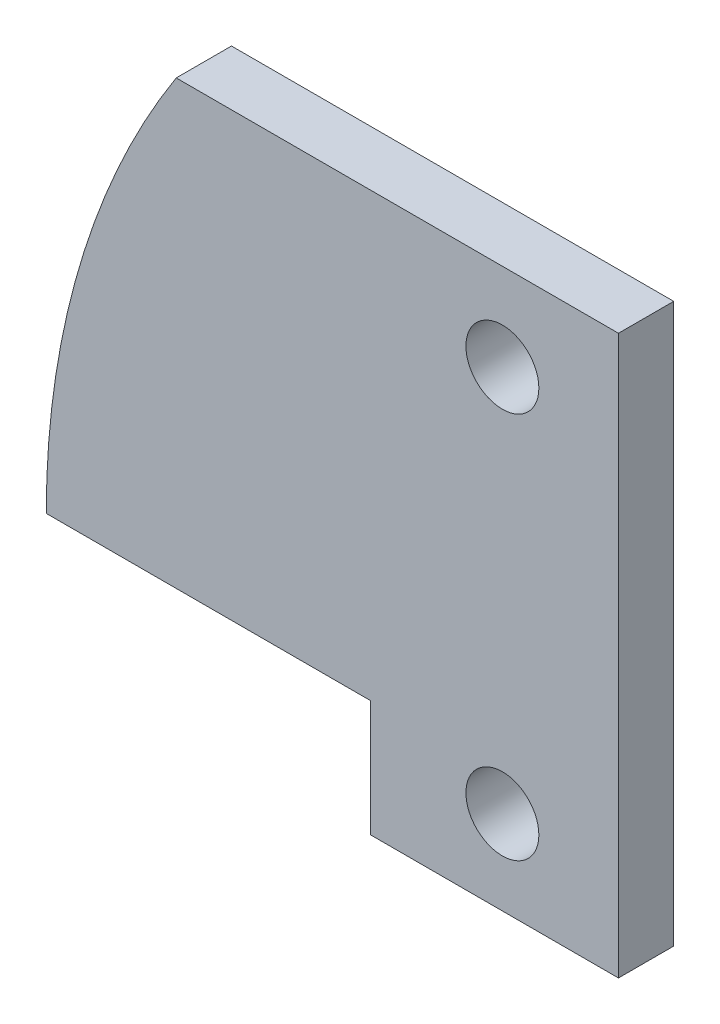
ISO-10303-21;
HEADER;
FILE_DESCRIPTION(('STEP AP214'),'2;1');
FILE_NAME('part.step','',(''),(''),'','','');
FILE_SCHEMA(('AUTOMOTIVE_DESIGN { 1 0 10303 214 1 1 1 1 }'));
ENDSEC;
DATA;
#1=APPLICATION_CONTEXT('core data for automotive mechanical design processes');
#2=APPLICATION_PROTOCOL_DEFINITION('international standard','automotive_design',2000,#1);
#3=PRODUCT_CONTEXT('',#1,'mechanical');
#4=PRODUCT('Part','Part','',(#3));
#5=PRODUCT_RELATED_PRODUCT_CATEGORY('part','',(#4));
#6=PRODUCT_DEFINITION_FORMATION('','',#4);
#7=PRODUCT_DEFINITION_CONTEXT('part definition',#1,'design');
#8=PRODUCT_DEFINITION('design','',#6,#7);
#9=PRODUCT_DEFINITION_SHAPE('','',#8);
#10=(LENGTH_UNIT() NAMED_UNIT(*) SI_UNIT(.MILLI.,.METRE.));
#11=(NAMED_UNIT(*) PLANE_ANGLE_UNIT() SI_UNIT($,.RADIAN.));
#12=(NAMED_UNIT(*) SI_UNIT($,.STERADIAN.) SOLID_ANGLE_UNIT());
#13=UNCERTAINTY_MEASURE_WITH_UNIT(LENGTH_MEASURE(1.E-05),#10,'distance_accuracy_value','');
#14=(GEOMETRIC_REPRESENTATION_CONTEXT(3) GLOBAL_UNCERTAINTY_ASSIGNED_CONTEXT((#13)) GLOBAL_UNIT_ASSIGNED_CONTEXT((#10,
#11,#12)) REPRESENTATION_CONTEXT('',''));
#15=CARTESIAN_POINT('',(0.,0.,0.));
#16=DIRECTION('',(0.,0.,1.));
#17=DIRECTION('',(1.,0.,0.));
#18=AXIS2_PLACEMENT_3D('',#15,#16,#17);
#19=CARTESIAN_POINT('',(23.0809539533338,3.25769141997411,2.5));
#20=DIRECTION('',(0.,0.,-1.));
#21=DIRECTION('',(-1.,0.,0.));
#22=AXIS2_PLACEMENT_3D('',#19,#20,#21);
#23=PLANE('',#22);
#24=CARTESIAN_POINT('',(23.0809539533338,3.25769141997411,2.5));
#25=DIRECTION('',(0.,0.,1.));
#26=DIRECTION('',(-1.,0.,0.));
#27=AXIS2_PLACEMENT_3D('',#24,#25,#26);
#28=CIRCLE('',#27,36.9636140147744);
#29=CARTESIAN_POINT('',(-8.00455329736466,23.2576914199741,2.5));
#30=VERTEX_POINT('',#29);
#31=CARTESIAN_POINT('',(-13.8826600614406,3.25769141997411,2.5));
#32=VERTEX_POINT('',#31);
#33=EDGE_CURVE('E153',#30,#32,#28,.T.);
#34=ORIENTED_EDGE('',*,*,#33,.T.);
#35=DIRECTION('',(1.,0.,0.));
#36=VECTOR('',#35,1.);
#37=CARTESIAN_POINT('',(-13.8826600614406,3.25769141997411,2.5));
#38=LINE('',#37,#36);
#39=CARTESIAN_POINT('',(0.775731814030067,3.25769141997411,2.5));
#40=VERTEX_POINT('',#39);
#41=EDGE_CURVE('E99',#32,#40,#38,.T.);
#42=ORIENTED_EDGE('',*,*,#41,.T.);
#43=DIRECTION('',(0.,-1.,0.));
#44=VECTOR('',#43,1.);
#45=CARTESIAN_POINT('',(0.775731814030067,3.25769141997411,2.5));
#46=LINE('',#45,#44);
#47=CARTESIAN_POINT('',(0.775731814030068,-2.,2.5));
#48=VERTEX_POINT('',#47);
#49=EDGE_CURVE('E112',#40,#48,#46,.T.);
#50=ORIENTED_EDGE('',*,*,#49,.T.);
#51=DIRECTION('',(1.,0.,0.));
#52=VECTOR('',#51,1.);
#53=CARTESIAN_POINT('',(0.775731814030068,-2.,2.5));
#54=LINE('',#53,#52);
#55=CARTESIAN_POINT('',(12.,-2.,2.5));
#56=VERTEX_POINT('',#55);
#57=EDGE_CURVE('E106',#48,#56,#54,.T.);
#58=ORIENTED_EDGE('',*,*,#57,.T.);
#59=DIRECTION('',(0.,1.,0.));
#60=VECTOR('',#59,1.);
#61=CARTESIAN_POINT('',(12.,-2.,2.5));
#62=LINE('',#61,#60);
#63=CARTESIAN_POINT('',(12.,23.2576914199741,2.5));
#64=VERTEX_POINT('',#63);
#65=EDGE_CURVE('E110',#56,#64,#62,.T.);
#66=ORIENTED_EDGE('',*,*,#65,.T.);
#67=DIRECTION('',(-1.,0.,0.));
#68=VECTOR('',#67,1.);
#69=CARTESIAN_POINT('',(-8.00455329736466,23.2576914199741,2.5));
#70=LINE('',#69,#68);
#71=EDGE_CURVE('E63',#64,#30,#70,.T.);
#72=ORIENTED_EDGE('',*,*,#71,.T.);
#73=EDGE_LOOP('',(#34,#42,#50,#58,#66,#72));
#74=FACE_BOUND('',#73,.T.);
#75=CARTESIAN_POINT('',(6.74921920985469,19.3061015005349,2.5));
#76=DIRECTION('',(0.,0.,1.));
#77=DIRECTION('',(1.,0.,0.));
#78=AXIS2_PLACEMENT_3D('',#75,#76,#77);
#79=CIRCLE('',#78,1.65);
#80=CARTESIAN_POINT('',(8.39921920985469,19.3061015005349,2.5));
#81=VERTEX_POINT('',#80);
#82=EDGE_CURVE('E140',#81,#81,#79,.T.);
#83=ORIENTED_EDGE('',*,*,#82,.F.);
#84=EDGE_LOOP('',(#83));
#85=FACE_BOUND('',#84,.T.);
#86=CARTESIAN_POINT('',(6.74921920985468,1.80610150053489,2.5));
#87=DIRECTION('',(0.,0.,1.));
#88=DIRECTION('',(1.,0.,0.));
#89=AXIS2_PLACEMENT_3D('',#86,#87,#88);
#90=CIRCLE('',#89,1.65);
#91=CARTESIAN_POINT('',(8.39921920985469,1.80610150053489,2.5));
#92=VERTEX_POINT('',#91);
#93=EDGE_CURVE('E198',#92,#92,#90,.T.);
#94=ORIENTED_EDGE('',*,*,#93,.F.);
#95=EDGE_LOOP('',(#94));
#96=FACE_BOUND('',#95,.T.);
#97=ADVANCED_FACE('F45',(#74,#85,#96),#23,.F.);
#98=CARTESIAN_POINT('',(23.0809539533338,3.25769141997411,0.));
#99=DIRECTION('',(0.,0.,-1.));
#100=DIRECTION('',(-1.,0.,0.));
#101=AXIS2_PLACEMENT_3D('',#98,#99,#100);
#102=PLANE('',#101);
#103=CARTESIAN_POINT('',(6.74921920985469,19.3061015005349,0.));
#104=DIRECTION('',(0.,0.,1.));
#105=DIRECTION('',(1.,0.,0.));
#106=AXIS2_PLACEMENT_3D('',#103,#104,#105);
#107=CIRCLE('',#106,1.65);
#108=CARTESIAN_POINT('',(8.39921920985469,19.3061015005349,0.));
#109=VERTEX_POINT('',#108);
#110=EDGE_CURVE('E205',#109,#109,#107,.T.);
#111=ORIENTED_EDGE('',*,*,#110,.T.);
#112=EDGE_LOOP('',(#111));
#113=FACE_BOUND('',#112,.T.);
#114=CARTESIAN_POINT('',(23.0809539533338,3.25769141997411,0.));
#115=DIRECTION('',(0.,0.,1.));
#116=DIRECTION('',(-1.,0.,0.));
#117=AXIS2_PLACEMENT_3D('',#114,#115,#116);
#118=CIRCLE('',#117,36.9636140147744);
#119=CARTESIAN_POINT('',(-8.00455329736466,23.2576914199741,0.));
#120=VERTEX_POINT('',#119);
#121=CARTESIAN_POINT('',(-13.8826600614406,3.25769141997411,0.));
#122=VERTEX_POINT('',#121);
#123=EDGE_CURVE('E135',#120,#122,#118,.T.);
#124=ORIENTED_EDGE('',*,*,#123,.F.);
#125=DIRECTION('',(-1.,0.,0.));
#126=VECTOR('',#125,1.);
#127=CARTESIAN_POINT('',(-8.00455329736466,23.2576914199741,0.));
#128=LINE('',#127,#126);
#129=CARTESIAN_POINT('',(12.,23.2576914199741,0.));
#130=VERTEX_POINT('',#129);
#131=EDGE_CURVE('E91',#130,#120,#128,.T.);
#132=ORIENTED_EDGE('',*,*,#131,.F.);
#133=DIRECTION('',(0.,1.,0.));
#134=VECTOR('',#133,1.);
#135=CARTESIAN_POINT('',(12.,23.2576914199741,0.));
#136=LINE('',#135,#134);
#137=CARTESIAN_POINT('',(12.,-2.,0.));
#138=VERTEX_POINT('',#137);
#139=EDGE_CURVE('E85',#138,#130,#136,.T.);
#140=ORIENTED_EDGE('',*,*,#139,.F.);
#141=DIRECTION('',(1.,0.,0.));
#142=VECTOR('',#141,1.);
#143=CARTESIAN_POINT('',(0.775731814030068,-2.,0.));
#144=LINE('',#143,#142);
#145=CARTESIAN_POINT('',(0.775731814030068,-2.,0.));
#146=VERTEX_POINT('',#145);
#147=EDGE_CURVE('E122',#146,#138,#144,.T.);
#148=ORIENTED_EDGE('',*,*,#147,.F.);
#149=DIRECTION('',(0.,-1.,0.));
#150=VECTOR('',#149,1.);
#151=CARTESIAN_POINT('',(0.775731814030067,0.,0.));
#152=LINE('',#151,#150);
#153=CARTESIAN_POINT('',(0.775731814030067,3.25769141997411,0.));
#154=VERTEX_POINT('',#153);
#155=EDGE_CURVE('E144',#154,#146,#152,.T.);
#156=ORIENTED_EDGE('',*,*,#155,.F.);
#157=DIRECTION('',(1.,0.,0.));
#158=VECTOR('',#157,1.);
#159=CARTESIAN_POINT('',(-13.8826600614406,3.25769141997411,0.));
#160=LINE('',#159,#158);
#161=EDGE_CURVE('E139',#122,#154,#160,.T.);
#162=ORIENTED_EDGE('',*,*,#161,.F.);
#163=EDGE_LOOP('',(#124,#132,#140,#148,#156,#162));
#164=FACE_BOUND('',#163,.T.);
#165=CARTESIAN_POINT('',(6.74921920985468,1.80610150053489,0.));
#166=DIRECTION('',(0.,0.,1.));
#167=DIRECTION('',(1.,0.,0.));
#168=AXIS2_PLACEMENT_3D('',#165,#166,#167);
#169=CIRCLE('',#168,1.65);
#170=CARTESIAN_POINT('',(8.39921920985469,1.80610150053489,0.));
#171=VERTEX_POINT('',#170);
#172=EDGE_CURVE('E201',#171,#171,#169,.T.);
#173=ORIENTED_EDGE('',*,*,#172,.T.);
#174=EDGE_LOOP('',(#173));
#175=FACE_BOUND('',#174,.T.);
#176=ADVANCED_FACE('F167',(#113,#164,#175),#102,.T.);
#177=CARTESIAN_POINT('',(23.0809539533338,3.25769141997411,2.5));
#178=DIRECTION('',(0.,0.,-1.));
#179=DIRECTION('',(-1.,0.,0.));
#180=AXIS2_PLACEMENT_3D('',#177,#178,#179);
#181=CYLINDRICAL_SURFACE('',#180,36.9636140147744);
#182=ORIENTED_EDGE('',*,*,#123,.T.);
#183=DIRECTION('',(0.,0.,-1.));
#184=VECTOR('',#183,1.);
#185=CARTESIAN_POINT('',(-13.8826600614406,3.25769141997411,2.5));
#186=LINE('',#185,#184);
#187=EDGE_CURVE('E11',#32,#122,#186,.T.);
#188=ORIENTED_EDGE('',*,*,#187,.F.);
#189=ORIENTED_EDGE('',*,*,#33,.F.);
#190=DIRECTION('',(0.,0.,-1.));
#191=VECTOR('',#190,1.);
#192=CARTESIAN_POINT('',(-8.00455329736466,23.2576914199741,2.5));
#193=LINE('',#192,#191);
#194=EDGE_CURVE('E131',#30,#120,#193,.T.);
#195=ORIENTED_EDGE('',*,*,#194,.T.);
#196=EDGE_LOOP('',(#182,#188,#189,#195));
#197=FACE_BOUND('',#196,.T.);
#198=ADVANCED_FACE('F47',(#197),#181,.T.);
#199=CARTESIAN_POINT('',(-13.8826600614406,3.25769141997411,2.5));
#200=DIRECTION('',(0.,1.,0.));
#201=DIRECTION('',(0.,0.,1.));
#202=AXIS2_PLACEMENT_3D('',#199,#200,#201);
#203=PLANE('',#202);
#204=ORIENTED_EDGE('',*,*,#161,.T.);
#205=DIRECTION('',(0.,0.,-1.));
#206=VECTOR('',#205,1.);
#207=CARTESIAN_POINT('',(0.775731814030067,3.25769141997411,2.5));
#208=LINE('',#207,#206);
#209=EDGE_CURVE('E55',#40,#154,#208,.T.);
#210=ORIENTED_EDGE('',*,*,#209,.F.);
#211=ORIENTED_EDGE('',*,*,#41,.F.);
#212=ORIENTED_EDGE('',*,*,#187,.T.);
#213=EDGE_LOOP('',(#204,#210,#211,#212));
#214=FACE_BOUND('',#213,.T.);
#215=ADVANCED_FACE('F163',(#214),#203,.F.);
#216=CARTESIAN_POINT('',(0.775731814030067,0.,2.5));
#217=DIRECTION('',(1.,0.,0.));
#218=DIRECTION('',(0.,1.,0.));
#219=AXIS2_PLACEMENT_3D('',#216,#217,#218);
#220=PLANE('',#219);
#221=ORIENTED_EDGE('',*,*,#155,.T.);
#222=DIRECTION('',(0.,0.,-1.));
#223=VECTOR('',#222,1.);
#224=CARTESIAN_POINT('',(0.775731814030068,-2.,2.5));
#225=LINE('',#224,#223);
#226=EDGE_CURVE('E124',#48,#146,#225,.T.);
#227=ORIENTED_EDGE('',*,*,#226,.F.);
#228=ORIENTED_EDGE('',*,*,#49,.F.);
#229=ORIENTED_EDGE('',*,*,#209,.T.);
#230=EDGE_LOOP('',(#221,#227,#228,#229));
#231=FACE_BOUND('',#230,.T.);
#232=ADVANCED_FACE('F162',(#231),#220,.F.);
#233=CARTESIAN_POINT('',(0.775731814030068,-2.,2.5));
#234=DIRECTION('',(0.,1.,0.));
#235=DIRECTION('',(-1.,0.,0.));
#236=AXIS2_PLACEMENT_3D('',#233,#234,#235);
#237=PLANE('',#236);
#238=ORIENTED_EDGE('',*,*,#147,.T.);
#239=DIRECTION('',(0.,0.,-1.));
#240=VECTOR('',#239,1.);
#241=CARTESIAN_POINT('',(12.,-2.,2.5));
#242=LINE('',#241,#240);
#243=EDGE_CURVE('E119',#56,#138,#242,.T.);
#244=ORIENTED_EDGE('',*,*,#243,.F.);
#245=ORIENTED_EDGE('',*,*,#57,.F.);
#246=ORIENTED_EDGE('',*,*,#226,.T.);
#247=EDGE_LOOP('',(#238,#244,#245,#246));
#248=FACE_BOUND('',#247,.T.);
#249=ADVANCED_FACE('F120',(#248),#237,.F.);
#250=CARTESIAN_POINT('',(12.,23.2576914199741,2.5));
#251=DIRECTION('',(-1.,0.,0.));
#252=DIRECTION('',(0.,0.,1.));
#253=AXIS2_PLACEMENT_3D('',#250,#251,#252);
#254=PLANE('',#253);
#255=ORIENTED_EDGE('',*,*,#139,.T.);
#256=DIRECTION('',(0.,0.,-1.));
#257=VECTOR('',#256,1.);
#258=CARTESIAN_POINT('',(12.,23.2576914199741,2.5));
#259=LINE('',#258,#257);
#260=EDGE_CURVE('E125',#64,#130,#259,.T.);
#261=ORIENTED_EDGE('',*,*,#260,.F.);
#262=ORIENTED_EDGE('',*,*,#65,.F.);
#263=ORIENTED_EDGE('',*,*,#243,.T.);
#264=EDGE_LOOP('',(#255,#261,#262,#263));
#265=FACE_BOUND('',#264,.T.);
#266=ADVANCED_FACE('F127',(#265),#254,.F.);
#267=CARTESIAN_POINT('',(-8.00455329736466,23.2576914199741,2.5));
#268=DIRECTION('',(0.,-1.,0.));
#269=DIRECTION('',(0.,0.,-1.));
#270=AXIS2_PLACEMENT_3D('',#267,#268,#269);
#271=PLANE('',#270);
#272=ORIENTED_EDGE('',*,*,#131,.T.);
#273=ORIENTED_EDGE('',*,*,#194,.F.);
#274=ORIENTED_EDGE('',*,*,#71,.F.);
#275=ORIENTED_EDGE('',*,*,#260,.T.);
#276=EDGE_LOOP('',(#272,#273,#274,#275));
#277=FACE_BOUND('',#276,.T.);
#278=ADVANCED_FACE('F171',(#277),#271,.F.);
#279=CARTESIAN_POINT('',(6.74921920985469,19.3061015005349,2.5));
#280=DIRECTION('',(0.,0.,-1.));
#281=DIRECTION('',(-1.,0.,0.));
#282=AXIS2_PLACEMENT_3D('',#279,#280,#281);
#283=CYLINDRICAL_SURFACE('',#282,1.65);
#284=ORIENTED_EDGE('',*,*,#82,.T.);
#285=EDGE_LOOP('',(#284));
#286=FACE_BOUND('',#285,.T.);
#287=ORIENTED_EDGE('',*,*,#110,.F.);
#288=EDGE_LOOP('',(#287));
#289=FACE_BOUND('',#288,.T.);
#290=ADVANCED_FACE('F173',(#286,#289),#283,.F.);
#291=CARTESIAN_POINT('',(6.74921920985468,1.80610150053489,2.5));
#292=DIRECTION('',(0.,0.,-1.));
#293=DIRECTION('',(-1.,0.,0.));
#294=AXIS2_PLACEMENT_3D('',#291,#292,#293);
#295=CYLINDRICAL_SURFACE('',#294,1.65);
#296=ORIENTED_EDGE('',*,*,#93,.T.);
#297=EDGE_LOOP('',(#296));
#298=FACE_BOUND('',#297,.T.);
#299=ORIENTED_EDGE('',*,*,#172,.F.);
#300=EDGE_LOOP('',(#299));
#301=FACE_BOUND('',#300,.T.);
#302=ADVANCED_FACE('F179',(#298,#301),#295,.F.);
#303=CLOSED_SHELL('',(#97,#176,#198,#215,#232,#249,#266,#278,#290,#302));
#304=MANIFOLD_SOLID_BREP('B2',#303);
#305=ADVANCED_BREP_SHAPE_REPRESENTATION('',(#18,#304),#14);
#306=SHAPE_DEFINITION_REPRESENTATION(#9,#305);
ENDSEC;
END-ISO-10303-21;
